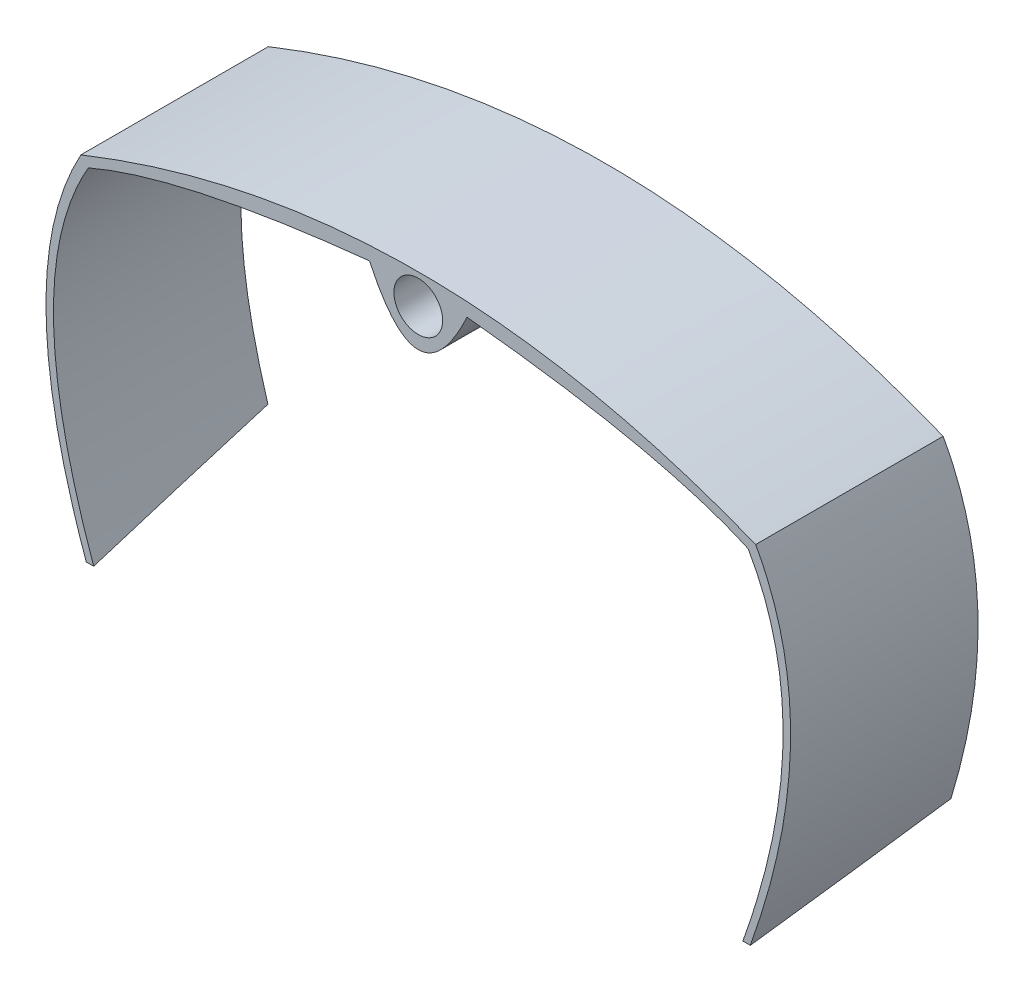
ISO-10303-21;
HEADER;
FILE_DESCRIPTION(('STEP AP214'),'2;1');
FILE_NAME('part.step','',(''),(''),'','','');
FILE_SCHEMA(('AUTOMOTIVE_DESIGN { 1 0 10303 214 1 1 1 1 }'));
ENDSEC;
DATA;
#1=APPLICATION_CONTEXT('core data for automotive mechanical design processes');
#2=APPLICATION_PROTOCOL_DEFINITION('international standard','automotive_design',2000,#1);
#3=PRODUCT_CONTEXT('',#1,'mechanical');
#4=PRODUCT('Part','Part','',(#3));
#5=PRODUCT_RELATED_PRODUCT_CATEGORY('part','',(#4));
#6=PRODUCT_DEFINITION_FORMATION('','',#4);
#7=PRODUCT_DEFINITION_CONTEXT('part definition',#1,'design');
#8=PRODUCT_DEFINITION('design','',#6,#7);
#9=PRODUCT_DEFINITION_SHAPE('','',#8);
#10=(LENGTH_UNIT() NAMED_UNIT(*) SI_UNIT(.MILLI.,.METRE.));
#11=(NAMED_UNIT(*) PLANE_ANGLE_UNIT() SI_UNIT($,.RADIAN.));
#12=(NAMED_UNIT(*) SI_UNIT($,.STERADIAN.) SOLID_ANGLE_UNIT());
#13=UNCERTAINTY_MEASURE_WITH_UNIT(LENGTH_MEASURE(1.E-05),#10,'distance_accuracy_value','');
#14=(GEOMETRIC_REPRESENTATION_CONTEXT(3) GLOBAL_UNCERTAINTY_ASSIGNED_CONTEXT((#13)) GLOBAL_UNIT_ASSIGNED_CONTEXT((#10,
#11,#12)) REPRESENTATION_CONTEXT('',''));
#15=CARTESIAN_POINT('',(0.,0.,0.));
#16=DIRECTION('',(0.,0.,1.));
#17=DIRECTION('',(1.,0.,0.));
#18=AXIS2_PLACEMENT_3D('',#15,#16,#17);
#19=CARTESIAN_POINT('',(-49.5,-28.75,25.));
#20=DIRECTION('',(0.,0.,-1.));
#21=DIRECTION('',(-1.,0.,0.));
#22=AXIS2_PLACEMENT_3D('',#19,#20,#21);
#23=PLANE('',#22);
#24=CARTESIAN_POINT('',(-45.,-5.,25.));
#25=CARTESIAN_POINT('',(-56.,-25.,25.));
#26=CARTESIAN_POINT('',(-41.,-60.,25.));
#27=B_SPLINE_CURVE_WITH_KNOTS('',2,(#24,#25,#26),.UNSPECIFIED.,.F.,.F.,(3,3),(0.,1.),.UNSPECIFIED.);
#28=CARTESIAN_POINT('',(-45.,-5.,25.));
#29=VERTEX_POINT('',#28);
#30=CARTESIAN_POINT('',(-44.281234529274,-51.6602052693694,25.));
#31=VERTEX_POINT('',#30);
#32=EDGE_CURVE('E204',#29,#31,#27,.T.);
#33=ORIENTED_EDGE('',*,*,#32,.T.);
#34=DIRECTION('',(1.,0.,0.));
#35=VECTOR('',#34,1.);
#36=CARTESIAN_POINT('',(-49.5,-51.6602052693694,25.));
#37=LINE('',#36,#35);
#38=CARTESIAN_POINT('',(-43.2865877292171,-51.6602052690512,24.9999999999378));
#39=VERTEX_POINT('',#38);
#40=EDGE_CURVE('E131',#31,#39,#37,.T.);
#41=ORIENTED_EDGE('',*,*,#40,.T.);
#42=CARTESIAN_POINT('',(-40.,-60.,25.));
#43=CARTESIAN_POINT('',(-55.,-25.,25.));
#44=CARTESIAN_POINT('',(-44.,-6.,25.));
#45=B_SPLINE_CURVE_WITH_KNOTS('',2,(#42,#43,#44),.UNSPECIFIED.,.F.,.F.,(3,3),(0.,1.),.UNSPECIFIED.);
#46=CARTESIAN_POINT('',(-44.,-6.,25.));
#47=VERTEX_POINT('',#46);
#48=EDGE_CURVE('E209',#39,#47,#45,.T.);
#49=ORIENTED_EDGE('',*,*,#48,.T.);
#50=CARTESIAN_POINT('',(-44.,-6.,25.));
#51=CARTESIAN_POINT('',(-31.6079509094557,-0.616387712279591,25.));
#52=CARTESIAN_POINT('',(-6.5,2.,25.));
#53=B_SPLINE_CURVE_WITH_KNOTS('',2,(#50,#51,#52),.UNSPECIFIED.,.F.,.F.,(3,3),(0.,1.),.UNSPECIFIED.);
#54=CARTESIAN_POINT('',(-6.5,2.,25.));
#55=VERTEX_POINT('',#54);
#56=EDGE_CURVE('E218',#47,#55,#53,.T.);
#57=ORIENTED_EDGE('',*,*,#56,.T.);
#58=CARTESIAN_POINT('',(-6.5,2.,25.));
#59=CARTESIAN_POINT('',(0.,-12.,25.));
#60=CARTESIAN_POINT('',(6.5,2.,25.));
#61=B_SPLINE_CURVE_WITH_KNOTS('',2,(#58,#59,#60),.UNSPECIFIED.,.F.,.F.,(3,3),(0.,1.),.UNSPECIFIED.);
#62=CARTESIAN_POINT('',(6.5,2.,25.));
#63=VERTEX_POINT('',#62);
#64=EDGE_CURVE('E237',#55,#63,#61,.T.);
#65=ORIENTED_EDGE('',*,*,#64,.T.);
#66=CARTESIAN_POINT('',(6.5,2.,25.));
#67=CARTESIAN_POINT('',(32.2286710129802,-0.616387712279591,25.));
#68=CARTESIAN_POINT('',(44.,-6.,25.));
#69=B_SPLINE_CURVE_WITH_KNOTS('',2,(#66,#67,#68),.UNSPECIFIED.,.F.,.F.,(3,3),(0.,1.),.UNSPECIFIED.);
#70=CARTESIAN_POINT('',(44.,-6.,25.));
#71=VERTEX_POINT('',#70);
#72=EDGE_CURVE('E140',#63,#71,#69,.T.);
#73=ORIENTED_EDGE('',*,*,#72,.T.);
#74=CARTESIAN_POINT('',(44.,-6.,25.));
#75=CARTESIAN_POINT('',(55.,-25.,25.));
#76=CARTESIAN_POINT('',(40.,-60.,25.));
#77=B_SPLINE_CURVE_WITH_KNOTS('',2,(#74,#75,#76),.UNSPECIFIED.,.F.,.F.,(3,3),(0.,1.),.UNSPECIFIED.);
#78=CARTESIAN_POINT('',(43.2865877292165,-51.6602052693694,25.));
#79=VERTEX_POINT('',#78);
#80=EDGE_CURVE('E128',#71,#79,#77,.T.);
#81=ORIENTED_EDGE('',*,*,#80,.T.);
#82=CARTESIAN_POINT('',(44.2812345292744,-51.6602052691703,24.9999999999611));
#83=VERTEX_POINT('',#82);
#84=EDGE_CURVE('E116',#79,#83,#37,.T.);
#85=ORIENTED_EDGE('',*,*,#84,.T.);
#86=CARTESIAN_POINT('',(41.,-60.,25.));
#87=CARTESIAN_POINT('',(56.,-25.,25.));
#88=CARTESIAN_POINT('',(45.,-5.,25.));
#89=B_SPLINE_CURVE_WITH_KNOTS('',2,(#86,#87,#88),.UNSPECIFIED.,.F.,.F.,(3,3),(0.,1.),.UNSPECIFIED.);
#90=CARTESIAN_POINT('',(45.,-5.,25.));
#91=VERTEX_POINT('',#90);
#92=EDGE_CURVE('E125',#83,#91,#89,.T.);
#93=ORIENTED_EDGE('',*,*,#92,.T.);
#94=CARTESIAN_POINT('',(45.,-5.,25.));
#95=CARTESIAN_POINT('',(0.,13.,25.));
#96=CARTESIAN_POINT('',(-45.,-5.,25.));
#97=B_SPLINE_CURVE_WITH_KNOTS('',2,(#94,#95,#96),.UNSPECIFIED.,.F.,.F.,(3,3),(0.,1.),.UNSPECIFIED.);
#98=EDGE_CURVE('E136',#91,#29,#97,.T.);
#99=ORIENTED_EDGE('',*,*,#98,.T.);
#100=EDGE_LOOP('',(#33,#41,#49,#57,#65,#73,#81,#85,#93,#99));
#101=FACE_BOUND('',#100,.T.);
#102=CARTESIAN_POINT('',(0.,0.,25.));
#103=DIRECTION('',(0.,0.,1.));
#104=DIRECTION('',(1.,0.,0.));
#105=AXIS2_PLACEMENT_3D('',#102,#103,#104);
#106=CIRCLE('',#105,3.25);
#107=CARTESIAN_POINT('',(3.25,0.,25.));
#108=VERTEX_POINT('',#107);
#109=EDGE_CURVE('E199',#108,#108,#106,.T.);
#110=ORIENTED_EDGE('',*,*,#109,.F.);
#111=EDGE_LOOP('',(#110));
#112=FACE_BOUND('',#111,.T.);
#113=ADVANCED_FACE('F33',(#101,#112),#23,.F.);
#114=CARTESIAN_POINT('',(-49.5,-28.75,0.));
#115=DIRECTION('',(0.,0.,-1.));
#116=DIRECTION('',(-1.,0.,0.));
#117=AXIS2_PLACEMENT_3D('',#114,#115,#116);
#118=PLANE('',#117);
#119=DIRECTION('',(1.,0.,0.));
#120=VECTOR('',#119,1.);
#121=CARTESIAN_POINT('',(-49.5,-46.3347614823872,0.));
#122=LINE('',#121,#120);
#123=CARTESIAN_POINT('',(-46.0408609140083,-46.3347614823872,0.));
#124=VERTEX_POINT('',#123);
#125=CARTESIAN_POINT('',(-45.0535807386001,-46.334761482494,0.));
#126=VERTEX_POINT('',#125);
#127=EDGE_CURVE('E56',#124,#126,#122,.T.);
#128=ORIENTED_EDGE('',*,*,#127,.F.);
#129=CARTESIAN_POINT('',(-45.,-5.,0.));
#130=CARTESIAN_POINT('',(-56.,-25.,0.));
#131=CARTESIAN_POINT('',(-41.,-60.,0.));
#132=B_SPLINE_CURVE_WITH_KNOTS('',2,(#129,#130,#131),.UNSPECIFIED.,.F.,.F.,(3,3),(0.,1.),.UNSPECIFIED.);
#133=CARTESIAN_POINT('',(-45.,-5.,0.));
#134=VERTEX_POINT('',#133);
#135=EDGE_CURVE('E202',#134,#124,#132,.T.);
#136=ORIENTED_EDGE('',*,*,#135,.F.);
#137=CARTESIAN_POINT('',(45.,-5.,0.));
#138=CARTESIAN_POINT('',(0.,13.,0.));
#139=CARTESIAN_POINT('',(-45.,-5.,0.));
#140=B_SPLINE_CURVE_WITH_KNOTS('',2,(#137,#138,#139),.UNSPECIFIED.,.F.,.F.,(3,3),(0.,1.),.UNSPECIFIED.);
#141=CARTESIAN_POINT('',(45.,-5.,0.));
#142=VERTEX_POINT('',#141);
#143=EDGE_CURVE('E210',#142,#134,#140,.T.);
#144=ORIENTED_EDGE('',*,*,#143,.F.);
#145=CARTESIAN_POINT('',(41.,-60.,0.));
#146=CARTESIAN_POINT('',(56.,-25.,0.));
#147=CARTESIAN_POINT('',(45.,-5.,0.));
#148=B_SPLINE_CURVE_WITH_KNOTS('',2,(#145,#146,#147),.UNSPECIFIED.,.F.,.F.,(3,3),(0.,1.),.UNSPECIFIED.);
#149=CARTESIAN_POINT('',(46.040860913847,-46.3347614819798,0.));
#150=VERTEX_POINT('',#149);
#151=EDGE_CURVE('E269',#150,#142,#148,.T.);
#152=ORIENTED_EDGE('',*,*,#151,.F.);
#153=CARTESIAN_POINT('',(45.0535807380844,-46.3347614823872,0.));
#154=VERTEX_POINT('',#153);
#155=EDGE_CURVE('E64',#154,#150,#122,.T.);
#156=ORIENTED_EDGE('',*,*,#155,.F.);
#157=CARTESIAN_POINT('',(44.,-6.,0.));
#158=CARTESIAN_POINT('',(55.,-25.,0.));
#159=CARTESIAN_POINT('',(40.,-60.,0.));
#160=B_SPLINE_CURVE_WITH_KNOTS('',2,(#157,#158,#159),.UNSPECIFIED.,.F.,.F.,(3,3),(0.,1.),.UNSPECIFIED.);
#161=CARTESIAN_POINT('',(44.,-6.,0.));
#162=VERTEX_POINT('',#161);
#163=EDGE_CURVE('E264',#162,#154,#160,.T.);
#164=ORIENTED_EDGE('',*,*,#163,.F.);
#165=CARTESIAN_POINT('',(6.5,2.,0.));
#166=CARTESIAN_POINT('',(32.2286710129802,-0.616387712279591,0.));
#167=CARTESIAN_POINT('',(44.,-6.,0.));
#168=B_SPLINE_CURVE_WITH_KNOTS('',2,(#165,#166,#167),.UNSPECIFIED.,.F.,.F.,(3,3),(0.,1.),.UNSPECIFIED.);
#169=CARTESIAN_POINT('',(6.5,2.,0.));
#170=VERTEX_POINT('',#169);
#171=EDGE_CURVE('E259',#170,#162,#168,.T.);
#172=ORIENTED_EDGE('',*,*,#171,.F.);
#173=CARTESIAN_POINT('',(-6.5,2.,0.));
#174=CARTESIAN_POINT('',(0.,-12.,0.));
#175=CARTESIAN_POINT('',(6.5,2.,0.));
#176=B_SPLINE_CURVE_WITH_KNOTS('',2,(#173,#174,#175),.UNSPECIFIED.,.F.,.F.,(3,3),(0.,1.),.UNSPECIFIED.);
#177=CARTESIAN_POINT('',(-6.5,2.,0.));
#178=VERTEX_POINT('',#177);
#179=EDGE_CURVE('E282',#178,#170,#176,.T.);
#180=ORIENTED_EDGE('',*,*,#179,.F.);
#181=CARTESIAN_POINT('',(-44.,-6.,0.));
#182=CARTESIAN_POINT('',(-31.6079509094557,-0.616387712279591,0.));
#183=CARTESIAN_POINT('',(-6.5,2.,0.));
#184=B_SPLINE_CURVE_WITH_KNOTS('',2,(#181,#182,#183),.UNSPECIFIED.,.F.,.F.,(3,3),(0.,1.),.UNSPECIFIED.);
#185=CARTESIAN_POINT('',(-44.,-6.,0.));
#186=VERTEX_POINT('',#185);
#187=EDGE_CURVE('E280',#186,#178,#184,.T.);
#188=ORIENTED_EDGE('',*,*,#187,.F.);
#189=CARTESIAN_POINT('',(-40.,-60.,0.));
#190=CARTESIAN_POINT('',(-55.,-25.,0.));
#191=CARTESIAN_POINT('',(-44.,-6.,0.));
#192=B_SPLINE_CURVE_WITH_KNOTS('',2,(#189,#190,#191),.UNSPECIFIED.,.F.,.F.,(3,3),(0.,1.),.UNSPECIFIED.);
#193=EDGE_CURVE('E274',#126,#186,#192,.T.);
#194=ORIENTED_EDGE('',*,*,#193,.F.);
#195=EDGE_LOOP('',(#128,#136,#144,#152,#156,#164,#172,#180,#188,#194));
#196=FACE_BOUND('',#195,.T.);
#197=CARTESIAN_POINT('',(0.,0.,0.));
#198=DIRECTION('',(0.,0.,1.));
#199=DIRECTION('',(1.,0.,0.));
#200=AXIS2_PLACEMENT_3D('',#197,#198,#199);
#201=CIRCLE('',#200,3.25);
#202=CARTESIAN_POINT('',(3.25,0.,0.));
#203=VERTEX_POINT('',#202);
#204=EDGE_CURVE('E198',#203,#203,#201,.T.);
#205=ORIENTED_EDGE('',*,*,#204,.T.);
#206=EDGE_LOOP('',(#205));
#207=FACE_BOUND('',#206,.T.);
#208=ADVANCED_FACE('F266',(#196,#207),#118,.T.);
#209=DIRECTION('',(0.,0.,-1.));
#210=VECTOR('',#209,1.);
#211=SURFACE_OF_LINEAR_EXTRUSION('',#27,#210);
#212=ORIENTED_EDGE('',*,*,#135,.T.);
#213=CARTESIAN_POINT('',(-46.0408609139434,-46.334761482009,-7.38571056312294E-11));
#214=CARTESIAN_POINT('',(-45.973497243795,-46.5567395073672,1.04206350676692));
#215=CARTESIAN_POINT('',(-45.9053597973613,-46.7787073324559,2.08407912965287));
#216=CARTESIAN_POINT('',(-45.7675603375881,-47.2226211536827,4.16800790119559));
#217=CARTESIAN_POINT('',(-45.6978983330569,-47.4445671499394,5.2099210504095));
#218=CARTESIAN_POINT('',(-45.5570722275444,-47.888437618864,7.29364630739349));
#219=CARTESIAN_POINT('',(-45.4859081321856,-48.1103620916094,8.33545841552711));
#220=CARTESIAN_POINT('',(-45.3420996263962,-48.5541898146979,10.4189830044466));
#221=CARTESIAN_POINT('',(-45.269455218625,-48.7760930650783,11.4606954854081));
#222=CARTESIAN_POINT('',(-45.1227074085552,-49.2198785767694,13.5440219152973));
#223=CARTESIAN_POINT('',(-45.0486040065532,-49.4417608380842,14.585635864245));
#224=CARTESIAN_POINT('',(-44.8989589570639,-49.8855047423577,16.6687669704165));
#225=CARTESIAN_POINT('',(-44.8234173067598,-50.1073663852753,17.7102841274466));
#226=CARTESIAN_POINT('',(-44.6709160753857,-50.5510693549766,19.7932230685448));
#227=CARTESIAN_POINT('',(-44.5939564889718,-50.7729106816806,20.8346448522384));
#228=CARTESIAN_POINT('',(-44.4386391047,-51.2165733166155,22.9173944440162));
#229=CARTESIAN_POINT('',(-44.3602812991472,-51.4383946247296,23.9587222515514));
#230=CARTESIAN_POINT('',(-44.2812345291449,-51.6602052693512,24.9999999999142));
#231=B_SPLINE_CURVE_WITH_KNOTS('',3,(#213,#214,#215,#216,#217,#218,#219,#220,#221,#222,#223,
#224,#225,#226,#227,#228,#229,#230),.UNSPECIFIED.,.F.,.F.,(4,2,2,2,2,2,2,2,4),(0.,
3.20271353749365,6.40540857575647,9.6080916282926,12.810768927723,16.013445576556,
19.2161284988269,22.4188234937969,25.6215361197558),.UNSPECIFIED.);
#232=EDGE_CURVE('E191',#124,#31,#231,.T.);
#233=ORIENTED_EDGE('',*,*,#232,.T.);
#234=ORIENTED_EDGE('',*,*,#32,.F.);
#235=DIRECTION('',(0.,0.,-1.));
#236=VECTOR('',#235,1.);
#237=CARTESIAN_POINT('',(-45.,-5.,25.));
#238=LINE('',#237,#236);
#239=EDGE_CURVE('E138',#29,#134,#238,.T.);
#240=ORIENTED_EDGE('',*,*,#239,.T.);
#241=EDGE_LOOP('',(#212,#233,#234,#240));
#242=FACE_BOUND('',#241,.T.);
#243=ADVANCED_FACE('F35',(#242),#211,.F.);
#244=DIRECTION('',(0.,0.,-1.));
#245=VECTOR('',#244,1.);
#246=SURFACE_OF_LINEAR_EXTRUSION('',#45,#245);
#247=ORIENTED_EDGE('',*,*,#48,.F.);
#248=CARTESIAN_POINT('',(-43.2865877292171,-51.6602052690512,24.9999999999378));
#249=CARTESIAN_POINT('',(-43.3658964542705,-51.438394305478,23.958720753357));
#250=CARTESIAN_POINT('',(-43.4445236117335,-51.2165727574821,22.9173918193335));
#251=CARTESIAN_POINT('',(-43.6003932365811,-50.7729097558295,20.834640505744));
#252=CARTESIAN_POINT('',(-43.6776357114753,-50.5510683022871,19.7932181267154));
#253=CARTESIAN_POINT('',(-43.8307149923526,-50.1073651718428,17.7102784310924));
#254=CARTESIAN_POINT('',(-43.9065518035666,-49.8855034950192,16.6687611148658));
#255=CARTESIAN_POINT('',(-44.0567980970484,-49.4417595945027,14.5856300263104));
#256=CARTESIAN_POINT('',(-44.1312075820846,-49.2198773708505,13.5440162541725));
#257=CARTESIAN_POINT('',(-44.2785770642665,-48.776091979819,11.4606903907244));
#258=CARTESIAN_POINT('',(-44.3515370610995,-48.5541888124353,10.418978299393));
#259=CARTESIAN_POINT('',(-44.4959847524902,-48.1103612823246,8.33545461637231));
#260=CARTESIAN_POINT('',(-44.567472444446,-47.8884369195611,7.29364302451041));
#261=CARTESIAN_POINT('',(-44.7089521798891,-47.4445666743234,5.2099188177009));
#262=CARTESIAN_POINT('',(-44.7789442178516,-47.222620791773,4.16800620239441));
#263=CARTESIAN_POINT('',(-44.9174085013519,-46.7787071774512,2.08407840182807));
#264=CARTESIAN_POINT('',(-44.9858807382048,-46.5567394455623,1.04206321601624));
#265=CARTESIAN_POINT('',(-45.0535807386001,-46.334761482494,5.01414881837192E-10));
#266=B_SPLINE_CURVE_WITH_KNOTS('',3,(#248,#249,#250,#251,#252,#253,#254,#255,#256,#257,#258,
#259,#260,#261,#262,#263,#264,#265),.UNSPECIFIED.,.F.,.F.,(4,2,2,2,2,2,2,2,4),(0.,
3.20277549979925,6.40553362472832,9.608279828866,12.8110198208217,16.0137605040713,
19.2165068466474,22.4192650175636,25.6220414860374),.UNSPECIFIED.);
#267=EDGE_CURVE('E175',#39,#126,#266,.T.);
#268=ORIENTED_EDGE('',*,*,#267,.T.);
#269=ORIENTED_EDGE('',*,*,#193,.T.);
#270=DIRECTION('',(0.,0.,-1.));
#271=VECTOR('',#270,1.);
#272=CARTESIAN_POINT('',(-44.,-6.,25.));
#273=LINE('',#272,#271);
#274=EDGE_CURVE('E49',#47,#186,#273,.T.);
#275=ORIENTED_EDGE('',*,*,#274,.F.);
#276=EDGE_LOOP('',(#247,#268,#269,#275));
#277=FACE_BOUND('',#276,.T.);
#278=ADVANCED_FACE('F226',(#277),#246,.F.);
#279=DIRECTION('',(0.,0.,-1.));
#280=VECTOR('',#279,1.);
#281=SURFACE_OF_LINEAR_EXTRUSION('',#53,#280);
#282=ORIENTED_EDGE('',*,*,#187,.T.);
#283=DIRECTION('',(0.,0.,-1.));
#284=VECTOR('',#283,1.);
#285=CARTESIAN_POINT('',(-6.5,2.,25.));
#286=LINE('',#285,#284);
#287=EDGE_CURVE('E331',#55,#178,#286,.T.);
#288=ORIENTED_EDGE('',*,*,#287,.F.);
#289=ORIENTED_EDGE('',*,*,#56,.F.);
#290=ORIENTED_EDGE('',*,*,#274,.T.);
#291=EDGE_LOOP('',(#282,#288,#289,#290));
#292=FACE_BOUND('',#291,.T.);
#293=ADVANCED_FACE('F230',(#292),#281,.F.);
#294=DIRECTION('',(0.,0.,-1.));
#295=VECTOR('',#294,1.);
#296=SURFACE_OF_LINEAR_EXTRUSION('',#61,#295);
#297=ORIENTED_EDGE('',*,*,#179,.T.);
#298=DIRECTION('',(0.,0.,-1.));
#299=VECTOR('',#298,1.);
#300=CARTESIAN_POINT('',(6.5,2.,25.));
#301=LINE('',#300,#299);
#302=EDGE_CURVE('E262',#63,#170,#301,.T.);
#303=ORIENTED_EDGE('',*,*,#302,.F.);
#304=ORIENTED_EDGE('',*,*,#64,.F.);
#305=ORIENTED_EDGE('',*,*,#287,.T.);
#306=EDGE_LOOP('',(#297,#303,#304,#305));
#307=FACE_BOUND('',#306,.T.);
#308=ADVANCED_FACE('F233',(#307),#296,.F.);
#309=DIRECTION('',(0.,0.,-1.));
#310=VECTOR('',#309,1.);
#311=SURFACE_OF_LINEAR_EXTRUSION('',#69,#310);
#312=ORIENTED_EDGE('',*,*,#171,.T.);
#313=DIRECTION('',(0.,0.,-1.));
#314=VECTOR('',#313,1.);
#315=CARTESIAN_POINT('',(44.,-6.,25.));
#316=LINE('',#315,#314);
#317=EDGE_CURVE('E257',#71,#162,#316,.T.);
#318=ORIENTED_EDGE('',*,*,#317,.F.);
#319=ORIENTED_EDGE('',*,*,#72,.F.);
#320=ORIENTED_EDGE('',*,*,#302,.T.);
#321=EDGE_LOOP('',(#312,#318,#319,#320));
#322=FACE_BOUND('',#321,.T.);
#323=ADVANCED_FACE('F166',(#322),#311,.F.);
#324=DIRECTION('',(0.,0.,-1.));
#325=VECTOR('',#324,1.);
#326=SURFACE_OF_LINEAR_EXTRUSION('',#77,#325);
#327=ORIENTED_EDGE('',*,*,#163,.T.);
#328=CARTESIAN_POINT('',(45.0535807379528,-46.3347614835502,2.27124232047898E-10));
#329=CARTESIAN_POINT('',(44.9858807379726,-46.5567394459408,1.04206321591438));
#330=CARTESIAN_POINT('',(44.9174085012899,-46.7787071775519,2.08407840179737));
#331=CARTESIAN_POINT('',(44.7789442179142,-47.2226207916704,4.1680062024163));
#332=CARTESIAN_POINT('',(44.708952179906,-47.4445666742955,5.20991881770421));
#333=CARTESIAN_POINT('',(44.5674724444296,-47.8884369195876,7.2936430245005));
#334=CARTESIAN_POINT('',(44.495984752486,-48.1103612823312,8.33545461636776));
#335=CARTESIAN_POINT('',(44.3515370611041,-48.5541888124276,10.4189782993926));
#336=CARTESIAN_POINT('',(44.2785770642675,-48.7760919798172,11.4606903907228));
#337=CARTESIAN_POINT('',(44.1312075820839,-49.2198773708516,13.5440162541706));
#338=CARTESIAN_POINT('',(44.0567980970497,-49.441759594501,14.5856300263094));
#339=CARTESIAN_POINT('',(43.9065518035655,-49.8855034950205,16.6687611148645));
#340=CARTESIAN_POINT('',(43.8307149923474,-50.1073651718499,17.7102784310898));
#341=CARTESIAN_POINT('',(43.6776357114806,-50.5510683022798,19.7932181267172));
#342=CARTESIAN_POINT('',(43.600393236601,-50.7729097558018,20.8346405057516));
#343=CARTESIAN_POINT('',(43.4445236117135,-51.2165727575101,22.9173918193272));
#344=CARTESIAN_POINT('',(43.3658964541959,-51.4383943055818,23.9587207533309));
#345=CARTESIAN_POINT('',(43.2865877290094,-51.6602052693402,24.9999999998628));
#346=B_SPLINE_CURVE_WITH_KNOTS('',3,(#328,#329,#330,#331,#332,#333,#334,#335,#336,#337,#338,
#339,#340,#341,#342,#343,#344,#345),.UNSPECIFIED.,.F.,.F.,(4,2,2,2,2,2,2,2,4),(0.,
3.20277646847606,6.40553463939315,9.60828098197013,12.8110216652205,16.0137616571767,
19.2165078613152,22.4192659862452,25.6220414860461),.UNSPECIFIED.);
#347=EDGE_CURVE('E129',#154,#79,#346,.T.);
#348=ORIENTED_EDGE('',*,*,#347,.T.);
#349=ORIENTED_EDGE('',*,*,#80,.F.);
#350=ORIENTED_EDGE('',*,*,#317,.T.);
#351=EDGE_LOOP('',(#327,#348,#349,#350));
#352=FACE_BOUND('',#351,.T.);
#353=ADVANCED_FACE('F161',(#352),#326,.F.);
#354=DIRECTION('',(0.,0.,-1.));
#355=VECTOR('',#354,1.);
#356=SURFACE_OF_LINEAR_EXTRUSION('',#89,#355);
#357=ORIENTED_EDGE('',*,*,#92,.F.);
#358=CARTESIAN_POINT('',(44.2812345292744,-51.6602052691703,24.9999999999611));
#359=CARTESIAN_POINT('',(44.3602812991938,-51.4383946246644,23.9587222515675));
#360=CARTESIAN_POINT('',(44.4386391047126,-51.2165733165979,22.9173944440196));
#361=CARTESIAN_POINT('',(44.5939564889594,-50.7729106816977,20.8346448522325));
#362=CARTESIAN_POINT('',(44.6709160753824,-50.551069354981,19.7932230685422));
#363=CARTESIAN_POINT('',(44.8234173067633,-50.1073663852703,17.7102841274465));
#364=CARTESIAN_POINT('',(44.898958957065,-49.885504742356,16.6687669704155));
#365=CARTESIAN_POINT('',(45.0486040065523,-49.4417608380853,14.5856358642432));
#366=CARTESIAN_POINT('',(45.1227074085547,-49.21987857677,13.5440219152957));
#367=CARTESIAN_POINT('',(45.2694552186257,-48.7760930650771,11.4606954854069));
#368=CARTESIAN_POINT('',(45.3420996263979,-48.5541898146951,10.4189830044458));
#369=CARTESIAN_POINT('',(45.4859081321842,-48.1103620916115,8.33545841552494));
#370=CARTESIAN_POINT('',(45.5570722275391,-47.8884376188726,7.29364630738967));
#371=CARTESIAN_POINT('',(45.6978983330624,-47.4445671499302,5.20992105041013));
#372=CARTESIAN_POINT('',(45.7675603376084,-47.2226211536492,4.16800790120233));
#373=CARTESIAN_POINT('',(45.9053597973413,-46.7787073324886,2.0840791296427));
#374=CARTESIAN_POINT('',(45.9734972437199,-46.5567395074903,1.04206350673373));
#375=CARTESIAN_POINT('',(46.0408609137339,-46.3347614823525,-1.6292175941679E-10));
#376=B_SPLINE_CURVE_WITH_KNOTS('',3,(#358,#359,#360,#361,#362,#363,#364,#365,#366,#367,#368,
#369,#370,#371,#372,#373,#374,#375),.UNSPECIFIED.,.F.,.F.,(4,2,2,2,2,2,2,2,4),(0.,
3.20271262595885,6.40540762092898,9.60809054319993,12.8107671920328,16.0134444914634,
19.2161275439996,22.4188225822625,25.6215361197566),.UNSPECIFIED.);
#377=EDGE_CURVE('E11',#83,#150,#376,.T.);
#378=ORIENTED_EDGE('',*,*,#377,.T.);
#379=ORIENTED_EDGE('',*,*,#151,.T.);
#380=DIRECTION('',(0.,0.,-1.));
#381=VECTOR('',#380,1.);
#382=CARTESIAN_POINT('',(45.,-5.,25.));
#383=LINE('',#382,#381);
#384=EDGE_CURVE('E134',#91,#142,#383,.T.);
#385=ORIENTED_EDGE('',*,*,#384,.F.);
#386=EDGE_LOOP('',(#357,#378,#379,#385));
#387=FACE_BOUND('',#386,.T.);
#388=ADVANCED_FACE('F132',(#387),#356,.F.);
#389=DIRECTION('',(0.,0.,-1.));
#390=VECTOR('',#389,1.);
#391=SURFACE_OF_LINEAR_EXTRUSION('',#97,#390);
#392=ORIENTED_EDGE('',*,*,#143,.T.);
#393=ORIENTED_EDGE('',*,*,#239,.F.);
#394=ORIENTED_EDGE('',*,*,#98,.F.);
#395=ORIENTED_EDGE('',*,*,#384,.T.);
#396=EDGE_LOOP('',(#392,#393,#394,#395));
#397=FACE_BOUND('',#396,.T.);
#398=ADVANCED_FACE('F160',(#397),#391,.F.);
#399=CARTESIAN_POINT('',(0.,0.,25.));
#400=DIRECTION('',(0.,0.,-1.));
#401=DIRECTION('',(-1.,0.,0.));
#402=AXIS2_PLACEMENT_3D('',#399,#400,#401);
#403=CYLINDRICAL_SURFACE('',#402,3.25);
#404=ORIENTED_EDGE('',*,*,#109,.T.);
#405=EDGE_LOOP('',(#404));
#406=FACE_BOUND('',#405,.T.);
#407=ORIENTED_EDGE('',*,*,#204,.F.);
#408=EDGE_LOOP('',(#407));
#409=FACE_BOUND('',#408,.T.);
#410=ADVANCED_FACE('F186',(#406,#409),#403,.F.);
#411=CARTESIAN_POINT('',(-50.5,-52.4923118185692,28.9062779670765));
#412=DIRECTION('',(0.,0.978055772308952,0.208343241438593));
#413=DIRECTION('',(0.,-0.208343241438593,0.978055772308952));
#414=AXIS2_PLACEMENT_3D('',#411,#412,#413);
#415=PLANE('',#414);
#416=ORIENTED_EDGE('',*,*,#155,.T.);
#417=ORIENTED_EDGE('',*,*,#377,.F.);
#418=ORIENTED_EDGE('',*,*,#84,.F.);
#419=ORIENTED_EDGE('',*,*,#347,.F.);
#420=EDGE_LOOP('',(#416,#417,#418,#419));
#421=FACE_BOUND('',#420,.T.);
#422=ADVANCED_FACE('F115',(#421),#415,.F.);
#423=ORIENTED_EDGE('',*,*,#127,.T.);
#424=ORIENTED_EDGE('',*,*,#267,.F.);
#425=ORIENTED_EDGE('',*,*,#40,.F.);
#426=ORIENTED_EDGE('',*,*,#232,.F.);
#427=EDGE_LOOP('',(#423,#424,#425,#426));
#428=FACE_BOUND('',#427,.T.);
#429=ADVANCED_FACE('F182',(#428),#415,.F.);
#430=CLOSED_SHELL('',(#113,#208,#243,#278,#293,#308,#323,#353,#388,#398,#410,#422,#429));
#431=MANIFOLD_SOLID_BREP('B2',#430);
#432=ADVANCED_BREP_SHAPE_REPRESENTATION('',(#18,#431),#14);
#433=SHAPE_DEFINITION_REPRESENTATION(#9,#432);
ENDSEC;
END-ISO-10303-21;
